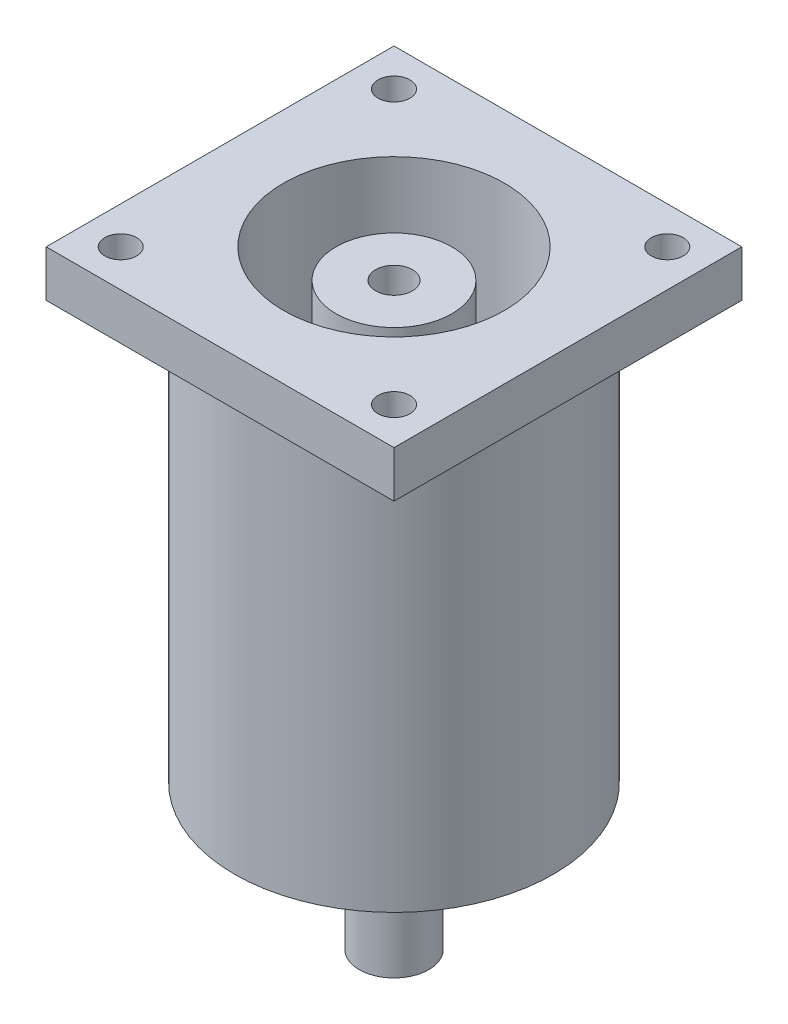
ISO-10303-21;
HEADER;
FILE_DESCRIPTION(('STEP AP214'),'2;1');
FILE_NAME('part.step','',(''),(''),'','','');
FILE_SCHEMA(('AUTOMOTIVE_DESIGN { 1 0 10303 214 1 1 1 1 }'));
ENDSEC;
DATA;
#1=APPLICATION_CONTEXT('core data for automotive mechanical design processes');
#2=APPLICATION_PROTOCOL_DEFINITION('international standard','automotive_design',2000,#1);
#3=PRODUCT_CONTEXT('',#1,'mechanical');
#4=PRODUCT('Part','Part','',(#3));
#5=PRODUCT_RELATED_PRODUCT_CATEGORY('part','',(#4));
#6=PRODUCT_DEFINITION_FORMATION('','',#4);
#7=PRODUCT_DEFINITION_CONTEXT('part definition',#1,'design');
#8=PRODUCT_DEFINITION('design','',#6,#7);
#9=PRODUCT_DEFINITION_SHAPE('','',#8);
#10=(LENGTH_UNIT() NAMED_UNIT(*) SI_UNIT(.MILLI.,.METRE.));
#11=(NAMED_UNIT(*) PLANE_ANGLE_UNIT() SI_UNIT($,.RADIAN.));
#12=(NAMED_UNIT(*) SI_UNIT($,.STERADIAN.) SOLID_ANGLE_UNIT());
#13=UNCERTAINTY_MEASURE_WITH_UNIT(LENGTH_MEASURE(1.E-05),#10,'distance_accuracy_value','');
#14=(GEOMETRIC_REPRESENTATION_CONTEXT(3) GLOBAL_UNCERTAINTY_ASSIGNED_CONTEXT((#13)) GLOBAL_UNIT_ASSIGNED_CONTEXT((#10,
#11,#12)) REPRESENTATION_CONTEXT('',''));
#15=CARTESIAN_POINT('',(0.,0.,0.));
#16=DIRECTION('',(0.,0.,1.));
#17=DIRECTION('',(1.,0.,0.));
#18=AXIS2_PLACEMENT_3D('',#15,#16,#17);
#19=CARTESIAN_POINT('',(0.,72.,0.));
#20=DIRECTION('',(0.,-1.,0.));
#21=DIRECTION('',(0.,0.,-1.));
#22=AXIS2_PLACEMENT_3D('',#19,#20,#21);
#23=CYLINDRICAL_SURFACE('',#22,27.5);
#24=CARTESIAN_POINT('',(0.,72.,0.));
#25=DIRECTION('',(0.,1.,0.));
#26=DIRECTION('',(0.,0.,1.));
#27=AXIS2_PLACEMENT_3D('',#24,#25,#26);
#28=CIRCLE('',#27,27.5);
#29=CARTESIAN_POINT('',(0.,72.,27.5));
#30=VERTEX_POINT('',#29);
#31=EDGE_CURVE('E139',#30,#30,#28,.T.);
#32=ORIENTED_EDGE('',*,*,#31,.F.);
#33=EDGE_LOOP('',(#32));
#34=FACE_BOUND('',#33,.T.);
#35=CARTESIAN_POINT('',(0.,0.,0.));
#36=DIRECTION('',(0.,1.,0.));
#37=DIRECTION('',(0.,0.,1.));
#38=AXIS2_PLACEMENT_3D('',#35,#36,#37);
#39=CIRCLE('',#38,27.5);
#40=CARTESIAN_POINT('',(0.,0.,27.5));
#41=VERTEX_POINT('',#40);
#42=EDGE_CURVE('E134',#41,#41,#39,.T.);
#43=ORIENTED_EDGE('',*,*,#42,.T.);
#44=EDGE_LOOP('',(#43));
#45=FACE_BOUND('',#44,.T.);
#46=ADVANCED_FACE('F39',(#34,#45),#23,.T.);
#47=CARTESIAN_POINT('',(0.,0.,0.));
#48=DIRECTION('',(0.,1.,0.));
#49=DIRECTION('',(0.,0.,1.));
#50=AXIS2_PLACEMENT_3D('',#47,#48,#49);
#51=PLANE('',#50);
#52=CARTESIAN_POINT('',(14.1421356237321,0.,-14.142135623731));
#53=DIRECTION('',(0.,-1.,0.));
#54=DIRECTION('',(0.,0.,-1.));
#55=AXIS2_PLACEMENT_3D('',#52,#53,#54);
#56=CIRCLE('',#55,1.99999999999969);
#57=CARTESIAN_POINT('',(14.1421356237321,0.,-16.1421356237306));
#58=VERTEX_POINT('',#57);
#59=EDGE_CURVE('E206',#58,#58,#56,.T.);
#60=ORIENTED_EDGE('',*,*,#59,.F.);
#61=EDGE_LOOP('',(#60));
#62=FACE_BOUND('',#61,.T.);
#63=CARTESIAN_POINT('',(-14.1421356237298,0.,-14.1421356237321));
#64=DIRECTION('',(0.,-1.,0.));
#65=DIRECTION('',(0.,0.,-1.));
#66=AXIS2_PLACEMENT_3D('',#63,#64,#65);
#67=CIRCLE('',#66,2.00000000000084);
#68=CARTESIAN_POINT('',(-14.1421356237298,0.,-16.142135623733));
#69=VERTEX_POINT('',#68);
#70=EDGE_CURVE('E198',#69,#69,#67,.T.);
#71=ORIENTED_EDGE('',*,*,#70,.F.);
#72=EDGE_LOOP('',(#71));
#73=FACE_BOUND('',#72,.T.);
#74=CARTESIAN_POINT('',(-14.1421356237309,0.,14.1421356237298));
#75=DIRECTION('',(0.,-1.,0.));
#76=DIRECTION('',(0.,0.,-1.));
#77=AXIS2_PLACEMENT_3D('',#74,#75,#76);
#78=CIRCLE('',#77,2.00000000000123);
#79=CARTESIAN_POINT('',(-14.1421356237309,0.,12.1421356237285));
#80=VERTEX_POINT('',#79);
#81=EDGE_CURVE('E189',#80,#80,#78,.T.);
#82=ORIENTED_EDGE('',*,*,#81,.F.);
#83=EDGE_LOOP('',(#82));
#84=FACE_BOUND('',#83,.T.);
#85=CARTESIAN_POINT('',(14.142135623731,0.,14.1421356237309));
#86=DIRECTION('',(0.,-1.,0.));
#87=DIRECTION('',(0.,0.,-1.));
#88=AXIS2_PLACEMENT_3D('',#85,#86,#87);
#89=CIRCLE('',#88,2.);
#90=CARTESIAN_POINT('',(14.142135623731,0.,12.1421356237309));
#91=VERTEX_POINT('',#90);
#92=EDGE_CURVE('E193',#91,#91,#89,.T.);
#93=ORIENTED_EDGE('',*,*,#92,.F.);
#94=EDGE_LOOP('',(#93));
#95=FACE_BOUND('',#94,.T.);
#96=CARTESIAN_POINT('',(0.,0.,0.));
#97=DIRECTION('',(0.,-1.,0.));
#98=DIRECTION('',(0.,0.,-1.));
#99=AXIS2_PLACEMENT_3D('',#96,#97,#98);
#100=CIRCLE('',#99,16.);
#101=CARTESIAN_POINT('',(0.,0.,-16.));
#102=VERTEX_POINT('',#101);
#103=EDGE_CURVE('E135',#102,#102,#100,.T.);
#104=ORIENTED_EDGE('',*,*,#103,.F.);
#105=EDGE_LOOP('',(#104));
#106=FACE_BOUND('',#105,.T.);
#107=ORIENTED_EDGE('',*,*,#42,.F.);
#108=EDGE_LOOP('',(#107));
#109=FACE_BOUND('',#108,.T.);
#110=ADVANCED_FACE('F240',(#62,#73,#84,#95,#106,#109),#51,.F.);
#111=CARTESIAN_POINT('',(0.,-2.5,0.));
#112=DIRECTION('',(0.,1.,0.));
#113=DIRECTION('',(0.,0.,1.));
#114=AXIS2_PLACEMENT_3D('',#111,#112,#113);
#115=CYLINDRICAL_SURFACE('',#114,16.);
#116=CARTESIAN_POINT('',(0.,-2.5,0.));
#117=DIRECTION('',(0.,-1.,0.));
#118=DIRECTION('',(0.,0.,-1.));
#119=AXIS2_PLACEMENT_3D('',#116,#117,#118);
#120=CIRCLE('',#119,16.);
#121=CARTESIAN_POINT('',(0.,-2.5,-16.));
#122=VERTEX_POINT('',#121);
#123=EDGE_CURVE('E130',#122,#122,#120,.T.);
#124=ORIENTED_EDGE('',*,*,#123,.F.);
#125=EDGE_LOOP('',(#124));
#126=FACE_BOUND('',#125,.T.);
#127=ORIENTED_EDGE('',*,*,#103,.T.);
#128=EDGE_LOOP('',(#127));
#129=FACE_BOUND('',#128,.T.);
#130=ADVANCED_FACE('F234',(#126,#129),#115,.T.);
#131=CARTESIAN_POINT('',(0.,-2.5,0.));
#132=DIRECTION('',(0.,-1.,0.));
#133=DIRECTION('',(0.,0.,-1.));
#134=AXIS2_PLACEMENT_3D('',#131,#132,#133);
#135=PLANE('',#134);
#136=CARTESIAN_POINT('',(0.,-2.5,0.));
#137=DIRECTION('',(0.,-1.,0.));
#138=DIRECTION('',(0.,0.,-1.));
#139=AXIS2_PLACEMENT_3D('',#136,#137,#138);
#140=CIRCLE('',#139,6.);
#141=CARTESIAN_POINT('',(0.,-2.5,6.));
#142=VERTEX_POINT('',#141);
#143=EDGE_CURVE('E49',#142,#142,#140,.T.);
#144=ORIENTED_EDGE('',*,*,#143,.F.);
#145=EDGE_LOOP('',(#144));
#146=FACE_BOUND('',#145,.T.);
#147=ORIENTED_EDGE('',*,*,#123,.T.);
#148=EDGE_LOOP('',(#147));
#149=FACE_BOUND('',#148,.T.);
#150=ADVANCED_FACE('F230',(#146,#149),#135,.T.);
#151=CARTESIAN_POINT('',(30.,80.,-30.));
#152=DIRECTION('',(-1.,0.,0.));
#153=DIRECTION('',(0.,0.,1.));
#154=AXIS2_PLACEMENT_3D('',#151,#152,#153);
#155=PLANE('',#154);
#156=DIRECTION('',(0.,0.,-1.));
#157=VECTOR('',#156,1.);
#158=CARTESIAN_POINT('',(30.,72.,-30.));
#159=LINE('',#158,#157);
#160=CARTESIAN_POINT('',(30.,72.,30.));
#161=VERTEX_POINT('',#160);
#162=CARTESIAN_POINT('',(30.,72.,-30.));
#163=VERTEX_POINT('',#162);
#164=EDGE_CURVE('E113',#161,#163,#159,.T.);
#165=ORIENTED_EDGE('',*,*,#164,.T.);
#166=DIRECTION('',(0.,-1.,0.));
#167=VECTOR('',#166,1.);
#168=CARTESIAN_POINT('',(30.,80.,-30.));
#169=LINE('',#168,#167);
#170=CARTESIAN_POINT('',(30.,80.,-30.));
#171=VERTEX_POINT('',#170);
#172=EDGE_CURVE('E102',#171,#163,#169,.T.);
#173=ORIENTED_EDGE('',*,*,#172,.F.);
#174=DIRECTION('',(0.,0.,-1.));
#175=VECTOR('',#174,1.);
#176=CARTESIAN_POINT('',(30.,80.,-30.));
#177=LINE('',#176,#175);
#178=CARTESIAN_POINT('',(30.,80.,30.));
#179=VERTEX_POINT('',#178);
#180=EDGE_CURVE('E94',#179,#171,#177,.T.);
#181=ORIENTED_EDGE('',*,*,#180,.F.);
#182=DIRECTION('',(0.,-1.,0.));
#183=VECTOR('',#182,1.);
#184=CARTESIAN_POINT('',(30.,80.,30.));
#185=LINE('',#184,#183);
#186=EDGE_CURVE('E109',#179,#161,#185,.T.);
#187=ORIENTED_EDGE('',*,*,#186,.T.);
#188=EDGE_LOOP('',(#165,#173,#181,#187));
#189=FACE_BOUND('',#188,.T.);
#190=ADVANCED_FACE('F233',(#189),#155,.F.);
#191=CARTESIAN_POINT('',(-30.,80.,-30.));
#192=DIRECTION('',(0.,0.,1.));
#193=DIRECTION('',(1.,0.,0.));
#194=AXIS2_PLACEMENT_3D('',#191,#192,#193);
#195=PLANE('',#194);
#196=DIRECTION('',(-1.,0.,0.));
#197=VECTOR('',#196,1.);
#198=CARTESIAN_POINT('',(-30.,72.,-30.));
#199=LINE('',#198,#197);
#200=CARTESIAN_POINT('',(-30.,72.,-30.));
#201=VERTEX_POINT('',#200);
#202=EDGE_CURVE('E100',#163,#201,#199,.T.);
#203=ORIENTED_EDGE('',*,*,#202,.T.);
#204=DIRECTION('',(0.,-1.,0.));
#205=VECTOR('',#204,1.);
#206=CARTESIAN_POINT('',(-30.,80.,-30.));
#207=LINE('',#206,#205);
#208=CARTESIAN_POINT('',(-30.,80.,-30.));
#209=VERTEX_POINT('',#208);
#210=EDGE_CURVE('E98',#209,#201,#207,.T.);
#211=ORIENTED_EDGE('',*,*,#210,.F.);
#212=DIRECTION('',(-1.,0.,0.));
#213=VECTOR('',#212,1.);
#214=CARTESIAN_POINT('',(-30.,80.,-30.));
#215=LINE('',#214,#213);
#216=EDGE_CURVE('E89',#171,#209,#215,.T.);
#217=ORIENTED_EDGE('',*,*,#216,.F.);
#218=ORIENTED_EDGE('',*,*,#172,.T.);
#219=EDGE_LOOP('',(#203,#211,#217,#218));
#220=FACE_BOUND('',#219,.T.);
#221=ADVANCED_FACE('F99',(#220),#195,.F.);
#222=CARTESIAN_POINT('',(-30.,80.,-30.));
#223=DIRECTION('',(1.,0.,0.));
#224=DIRECTION('',(0.,0.,-1.));
#225=AXIS2_PLACEMENT_3D('',#222,#223,#224);
#226=PLANE('',#225);
#227=DIRECTION('',(0.,0.,1.));
#228=VECTOR('',#227,1.);
#229=CARTESIAN_POINT('',(-30.,72.,-30.));
#230=LINE('',#229,#228);
#231=CARTESIAN_POINT('',(-30.,72.,30.));
#232=VERTEX_POINT('',#231);
#233=EDGE_CURVE('E75',#201,#232,#230,.T.);
#234=ORIENTED_EDGE('',*,*,#233,.T.);
#235=DIRECTION('',(0.,-1.,0.));
#236=VECTOR('',#235,1.);
#237=CARTESIAN_POINT('',(-30.,80.,30.));
#238=LINE('',#237,#236);
#239=CARTESIAN_POINT('',(-30.,80.,30.));
#240=VERTEX_POINT('',#239);
#241=EDGE_CURVE('E103',#240,#232,#238,.T.);
#242=ORIENTED_EDGE('',*,*,#241,.F.);
#243=DIRECTION('',(0.,0.,1.));
#244=VECTOR('',#243,1.);
#245=CARTESIAN_POINT('',(-30.,80.,-30.));
#246=LINE('',#245,#244);
#247=EDGE_CURVE('E92',#209,#240,#246,.T.);
#248=ORIENTED_EDGE('',*,*,#247,.F.);
#249=ORIENTED_EDGE('',*,*,#210,.T.);
#250=EDGE_LOOP('',(#234,#242,#248,#249));
#251=FACE_BOUND('',#250,.T.);
#252=ADVANCED_FACE('F105',(#251),#226,.F.);
#253=CARTESIAN_POINT('',(-30.,80.,30.));
#254=DIRECTION('',(0.,0.,-1.));
#255=DIRECTION('',(-1.,0.,0.));
#256=AXIS2_PLACEMENT_3D('',#253,#254,#255);
#257=PLANE('',#256);
#258=DIRECTION('',(1.,0.,0.));
#259=VECTOR('',#258,1.);
#260=CARTESIAN_POINT('',(-30.,72.,30.));
#261=LINE('',#260,#259);
#262=EDGE_CURVE('E81',#232,#161,#261,.T.);
#263=ORIENTED_EDGE('',*,*,#262,.T.);
#264=ORIENTED_EDGE('',*,*,#186,.F.);
#265=DIRECTION('',(1.,0.,0.));
#266=VECTOR('',#265,1.);
#267=CARTESIAN_POINT('',(-30.,80.,30.));
#268=LINE('',#267,#266);
#269=EDGE_CURVE('E58',#240,#179,#268,.T.);
#270=ORIENTED_EDGE('',*,*,#269,.F.);
#271=ORIENTED_EDGE('',*,*,#241,.T.);
#272=EDGE_LOOP('',(#263,#264,#270,#271));
#273=FACE_BOUND('',#272,.T.);
#274=ADVANCED_FACE('F261',(#273),#257,.F.);
#275=CARTESIAN_POINT('',(0.,80.,0.));
#276=DIRECTION('',(0.,1.,0.));
#277=DIRECTION('',(0.,0.,1.));
#278=AXIS2_PLACEMENT_3D('',#275,#276,#277);
#279=PLANE('',#278);
#280=CARTESIAN_POINT('',(23.5714045508536,80.,-23.5714045508535));
#281=DIRECTION('',(0.,1.,0.));
#282=DIRECTION('',(0.,0.,1.));
#283=AXIS2_PLACEMENT_3D('',#280,#281,#282);
#284=CIRCLE('',#283,2.75);
#285=CARTESIAN_POINT('',(23.5714045508536,80.,-20.8214045508535));
#286=VERTEX_POINT('',#285);
#287=EDGE_CURVE('E520',#286,#286,#284,.T.);
#288=ORIENTED_EDGE('',*,*,#287,.F.);
#289=EDGE_LOOP('',(#288));
#290=FACE_BOUND('',#289,.T.);
#291=CARTESIAN_POINT('',(-23.5714045508536,80.,-23.5714045508536));
#292=DIRECTION('',(0.,1.,0.));
#293=DIRECTION('',(0.,0.,1.));
#294=AXIS2_PLACEMENT_3D('',#291,#292,#293);
#295=CIRCLE('',#294,2.75);
#296=CARTESIAN_POINT('',(-23.5714045508536,80.,-20.8214045508536));
#297=VERTEX_POINT('',#296);
#298=EDGE_CURVE('E522',#297,#297,#295,.T.);
#299=ORIENTED_EDGE('',*,*,#298,.F.);
#300=EDGE_LOOP('',(#299));
#301=FACE_BOUND('',#300,.T.);
#302=CARTESIAN_POINT('',(-23.5714045508536,80.,23.5714045508535));
#303=DIRECTION('',(0.,1.,0.));
#304=DIRECTION('',(0.,0.,1.));
#305=AXIS2_PLACEMENT_3D('',#302,#303,#304);
#306=CIRCLE('',#305,2.75);
#307=CARTESIAN_POINT('',(-23.5714045508536,80.,26.3214045508535));
#308=VERTEX_POINT('',#307);
#309=EDGE_CURVE('E525',#308,#308,#306,.T.);
#310=ORIENTED_EDGE('',*,*,#309,.F.);
#311=EDGE_LOOP('',(#310));
#312=FACE_BOUND('',#311,.T.);
#313=CARTESIAN_POINT('',(23.5714045508536,80.,23.5714045508536));
#314=DIRECTION('',(0.,1.,0.));
#315=DIRECTION('',(0.,0.,1.));
#316=AXIS2_PLACEMENT_3D('',#313,#314,#315);
#317=CIRCLE('',#316,2.74999999999999);
#318=CARTESIAN_POINT('',(23.5714045508536,80.,26.3214045508536));
#319=VERTEX_POINT('',#318);
#320=EDGE_CURVE('E151',#319,#319,#317,.T.);
#321=ORIENTED_EDGE('',*,*,#320,.F.);
#322=EDGE_LOOP('',(#321));
#323=FACE_BOUND('',#322,.T.);
#324=CARTESIAN_POINT('',(0.,80.,0.));
#325=DIRECTION('',(0.,1.,0.));
#326=DIRECTION('',(0.,0.,1.));
#327=AXIS2_PLACEMENT_3D('',#324,#325,#326);
#328=CIRCLE('',#327,19.05);
#329=CARTESIAN_POINT('',(0.,80.,19.05));
#330=VERTEX_POINT('',#329);
#331=EDGE_CURVE('E179',#330,#330,#328,.T.);
#332=ORIENTED_EDGE('',*,*,#331,.F.);
#333=EDGE_LOOP('',(#332));
#334=FACE_BOUND('',#333,.T.);
#335=ORIENTED_EDGE('',*,*,#180,.T.);
#336=ORIENTED_EDGE('',*,*,#216,.T.);
#337=ORIENTED_EDGE('',*,*,#247,.T.);
#338=ORIENTED_EDGE('',*,*,#269,.T.);
#339=EDGE_LOOP('',(#335,#336,#337,#338));
#340=FACE_BOUND('',#339,.T.);
#341=ADVANCED_FACE('F90',(#290,#301,#312,#323,#334,#340),#279,.T.);
#342=CARTESIAN_POINT('',(0.,72.,0.));
#343=DIRECTION('',(0.,1.,0.));
#344=DIRECTION('',(0.,0.,1.));
#345=AXIS2_PLACEMENT_3D('',#342,#343,#344);
#346=PLANE('',#345);
#347=CARTESIAN_POINT('',(23.5714045508536,72.,-23.5714045508535));
#348=DIRECTION('',(0.,1.,0.));
#349=DIRECTION('',(0.,0.,1.));
#350=AXIS2_PLACEMENT_3D('',#347,#348,#349);
#351=CIRCLE('',#350,2.75);
#352=CARTESIAN_POINT('',(23.5714045508536,72.,-20.8214045508535));
#353=VERTEX_POINT('',#352);
#354=EDGE_CURVE('E42',#353,#353,#351,.T.);
#355=ORIENTED_EDGE('',*,*,#354,.T.);
#356=EDGE_LOOP('',(#355));
#357=FACE_BOUND('',#356,.T.);
#358=CARTESIAN_POINT('',(-23.5714045508536,72.,-23.5714045508536));
#359=DIRECTION('',(0.,1.,0.));
#360=DIRECTION('',(0.,0.,1.));
#361=AXIS2_PLACEMENT_3D('',#358,#359,#360);
#362=CIRCLE('',#361,2.75);
#363=CARTESIAN_POINT('',(-23.5714045508536,72.,-20.8214045508536));
#364=VERTEX_POINT('',#363);
#365=EDGE_CURVE('E154',#364,#364,#362,.T.);
#366=ORIENTED_EDGE('',*,*,#365,.T.);
#367=EDGE_LOOP('',(#366));
#368=FACE_BOUND('',#367,.T.);
#369=CARTESIAN_POINT('',(-23.5714045508536,72.,23.5714045508535));
#370=DIRECTION('',(0.,1.,0.));
#371=DIRECTION('',(0.,0.,1.));
#372=AXIS2_PLACEMENT_3D('',#369,#370,#371);
#373=CIRCLE('',#372,2.75);
#374=CARTESIAN_POINT('',(-23.5714045508536,72.,26.3214045508535));
#375=VERTEX_POINT('',#374);
#376=EDGE_CURVE('E150',#375,#375,#373,.T.);
#377=ORIENTED_EDGE('',*,*,#376,.T.);
#378=EDGE_LOOP('',(#377));
#379=FACE_BOUND('',#378,.T.);
#380=CARTESIAN_POINT('',(23.5714045508536,72.,23.5714045508536));
#381=DIRECTION('',(0.,1.,0.));
#382=DIRECTION('',(0.,0.,1.));
#383=AXIS2_PLACEMENT_3D('',#380,#381,#382);
#384=CIRCLE('',#383,2.74999999999999);
#385=CARTESIAN_POINT('',(23.5714045508536,72.,26.3214045508536));
#386=VERTEX_POINT('',#385);
#387=EDGE_CURVE('E146',#386,#386,#384,.T.);
#388=ORIENTED_EDGE('',*,*,#387,.T.);
#389=EDGE_LOOP('',(#388));
#390=FACE_BOUND('',#389,.T.);
#391=ORIENTED_EDGE('',*,*,#31,.T.);
#392=EDGE_LOOP('',(#391));
#393=FACE_BOUND('',#392,.T.);
#394=ORIENTED_EDGE('',*,*,#164,.F.);
#395=ORIENTED_EDGE('',*,*,#262,.F.);
#396=ORIENTED_EDGE('',*,*,#233,.F.);
#397=ORIENTED_EDGE('',*,*,#202,.F.);
#398=EDGE_LOOP('',(#394,#395,#396,#397));
#399=FACE_BOUND('',#398,.T.);
#400=ADVANCED_FACE('F255',(#357,#368,#379,#390,#393,#399),#346,.F.);
#401=CARTESIAN_POINT('',(0.,-25.,0.));
#402=DIRECTION('',(0.,1.,0.));
#403=DIRECTION('',(0.,0.,1.));
#404=AXIS2_PLACEMENT_3D('',#401,#402,#403);
#405=CYLINDRICAL_SURFACE('',#404,6.);
#406=CARTESIAN_POINT('',(0.,-25.,0.));
#407=DIRECTION('',(0.,-1.,0.));
#408=DIRECTION('',(0.,0.,-1.));
#409=AXIS2_PLACEMENT_3D('',#406,#407,#408);
#410=CIRCLE('',#409,6.);
#411=CARTESIAN_POINT('',(0.,-25.,6.));
#412=VERTEX_POINT('',#411);
#413=EDGE_CURVE('E117',#412,#412,#410,.T.);
#414=CARTESIAN_POINT('',(0.,-25.,6.));
#415=CARTESIAN_POINT('',(0.,-24.765625,6.));
#416=CARTESIAN_POINT('',(0.,-24.53125,6.));
#417=CARTESIAN_POINT('',(0.,-24.0625,6.));
#418=CARTESIAN_POINT('',(0.,-23.828125,6.));
#419=CARTESIAN_POINT('',(0.,-23.359375,6.));
#420=CARTESIAN_POINT('',(0.,-23.125,6.));
#421=CARTESIAN_POINT('',(0.,-22.65625,6.));
#422=CARTESIAN_POINT('',(0.,-22.421875,6.));
#423=CARTESIAN_POINT('',(0.,-21.953125,6.));
#424=CARTESIAN_POINT('',(0.,-21.71875,6.));
#425=CARTESIAN_POINT('',(0.,-21.25,6.));
#426=CARTESIAN_POINT('',(0.,-21.015625,6.));
#427=CARTESIAN_POINT('',(0.,-20.546875,6.));
#428=CARTESIAN_POINT('',(0.,-20.3125,6.));
#429=CARTESIAN_POINT('',(0.,-19.84375,6.));
#430=CARTESIAN_POINT('',(0.,-19.609375,6.));
#431=CARTESIAN_POINT('',(0.,-19.140625,6.));
#432=CARTESIAN_POINT('',(0.,-18.90625,6.));
#433=CARTESIAN_POINT('',(0.,-18.4375,6.));
#434=CARTESIAN_POINT('',(0.,-18.203125,6.));
#435=CARTESIAN_POINT('',(0.,-17.734375,6.));
#436=CARTESIAN_POINT('',(0.,-17.5,6.));
#437=CARTESIAN_POINT('',(0.,-17.03125,6.));
#438=CARTESIAN_POINT('',(0.,-16.796875,6.));
#439=CARTESIAN_POINT('',(0.,-16.328125,6.));
#440=CARTESIAN_POINT('',(0.,-16.09375,6.));
#441=CARTESIAN_POINT('',(0.,-15.625,6.));
#442=CARTESIAN_POINT('',(0.,-15.390625,6.));
#443=CARTESIAN_POINT('',(0.,-14.921875,6.));
#444=CARTESIAN_POINT('',(0.,-14.6875,6.));
#445=CARTESIAN_POINT('',(0.,-14.21875,6.));
#446=CARTESIAN_POINT('',(0.,-13.984375,6.));
#447=CARTESIAN_POINT('',(0.,-13.515625,6.));
#448=CARTESIAN_POINT('',(0.,-13.28125,6.));
#449=CARTESIAN_POINT('',(0.,-12.8125,6.));
#450=CARTESIAN_POINT('',(0.,-12.578125,6.));
#451=CARTESIAN_POINT('',(0.,-12.109375,6.));
#452=CARTESIAN_POINT('',(0.,-11.875,6.));
#453=CARTESIAN_POINT('',(0.,-11.40625,6.));
#454=CARTESIAN_POINT('',(0.,-11.171875,6.));
#455=CARTESIAN_POINT('',(0.,-10.703125,6.));
#456=CARTESIAN_POINT('',(0.,-10.46875,6.));
#457=CARTESIAN_POINT('',(0.,-10.,6.));
#458=CARTESIAN_POINT('',(0.,-9.765625,6.));
#459=CARTESIAN_POINT('',(0.,-9.296875,6.));
#460=CARTESIAN_POINT('',(0.,-9.0625,6.));
#461=CARTESIAN_POINT('',(0.,-8.59375,6.));
#462=CARTESIAN_POINT('',(0.,-8.359375,6.));
#463=CARTESIAN_POINT('',(0.,-7.890625,6.));
#464=CARTESIAN_POINT('',(0.,-7.65625,6.));
#465=CARTESIAN_POINT('',(0.,-7.1875,6.));
#466=CARTESIAN_POINT('',(0.,-6.953125,6.));
#467=CARTESIAN_POINT('',(0.,-6.484375,6.));
#468=CARTESIAN_POINT('',(0.,-6.25,6.));
#469=CARTESIAN_POINT('',(0.,-5.78125,6.));
#470=CARTESIAN_POINT('',(0.,-5.546875,6.));
#471=CARTESIAN_POINT('',(0.,-5.078125,6.));
#472=CARTESIAN_POINT('',(0.,-4.84375,6.));
#473=CARTESIAN_POINT('',(0.,-4.375,6.));
#474=CARTESIAN_POINT('',(0.,-4.140625,6.));
#475=CARTESIAN_POINT('',(0.,-3.671875,6.));
#476=CARTESIAN_POINT('',(0.,-3.4375,6.));
#477=CARTESIAN_POINT('',(0.,-2.96875,6.));
#478=CARTESIAN_POINT('',(0.,-2.734375,6.));
#479=CARTESIAN_POINT('',(0.,-2.5,6.));
#480=B_SPLINE_CURVE_WITH_KNOTS('',3,(#414,#415,#416,#417,#418,#419,#420,#421,#422,#423,#424,
#425,#426,#427,#428,#429,#430,#431,#432,#433,#434,#435,#436,#437,#438,#439,#440,#441,#442,#443,
#444,#445,#446,#447,#448,#449,#450,#451,#452,#453,#454,#455,#456,#457,#458,#459,#460,#461,#462,
#463,#464,#465,#466,#467,#468,#469,#470,#471,#472,#473,#474,#475,#476,#477,#478,#479),
.UNSPECIFIED.,.F.,.F.,(4,2,2,2,2,2,2,2,2,2,2,2,2,2,2,2,2,2,2,2,2,2,2,2,2,2,2,2,2,2,2,2,4),(0.,
0.703124999999999,1.40625,2.109375,2.8125,3.515625,4.21875,4.921875,5.625,6.328125,7.03125,
7.73437499999999,8.43749999999999,9.14062499999999,9.84374999999999,10.546875,11.25,11.953125,
12.65625,13.359375,14.0625,14.765625,15.46875,16.171875,16.875,17.578125,18.28125,18.984375,
19.6875,20.390625,21.09375,21.796875,22.5),.UNSPECIFIED.);
#481=EDGE_CURVE('BSEAM228',#412,#142,#480,.T.);
#482=ORIENTED_EDGE('',*,*,#413,.F.);
#483=ORIENTED_EDGE('',*,*,#143,.T.);
#484=ORIENTED_EDGE('',*,*,#481,.T.);
#485=ORIENTED_EDGE('',*,*,#481,.F.);
#486=EDGE_LOOP('',(#482,#484,#483,#485));
#487=FACE_BOUND('',#486,.T.);
#488=ADVANCED_FACE('F228',(#487),#405,.T.);
#489=CARTESIAN_POINT('',(0.,-25.,0.));
#490=DIRECTION('',(0.,-1.,0.));
#491=DIRECTION('',(0.,0.,-1.));
#492=AXIS2_PLACEMENT_3D('',#489,#490,#491);
#493=PLANE('',#492);
#494=ORIENTED_EDGE('',*,*,#413,.T.);
#495=EDGE_LOOP('',(#494));
#496=FACE_BOUND('',#495,.T.);
#497=ADVANCED_FACE('F307',(#496),#493,.T.);
#498=CARTESIAN_POINT('',(14.142135623731,16.,14.1421356237309));
#499=DIRECTION('',(0.,-1.,0.));
#500=DIRECTION('',(0.,0.,-1.));
#501=AXIS2_PLACEMENT_3D('',#498,#499,#500);
#502=CYLINDRICAL_SURFACE('',#501,2.);
#503=CARTESIAN_POINT('',(14.142135623731,16.,14.1421356237309));
#504=DIRECTION('',(0.,-1.,0.));
#505=DIRECTION('',(0.,0.,-1.));
#506=AXIS2_PLACEMENT_3D('',#503,#504,#505);
#507=CIRCLE('',#506,2.);
#508=CARTESIAN_POINT('',(14.142135623731,16.,12.1421356237309));
#509=VERTEX_POINT('',#508);
#510=EDGE_CURVE('E213',#509,#509,#507,.T.);
#511=ORIENTED_EDGE('',*,*,#510,.F.);
#512=EDGE_LOOP('',(#511));
#513=FACE_BOUND('',#512,.T.);
#514=ORIENTED_EDGE('',*,*,#92,.T.);
#515=EDGE_LOOP('',(#514));
#516=FACE_BOUND('',#515,.T.);
#517=ADVANCED_FACE('F318',(#513,#516),#502,.F.);
#518=CARTESIAN_POINT('',(14.142135623731,16.,14.1421356237309));
#519=DIRECTION('',(0.,-1.,0.));
#520=DIRECTION('',(0.,0.,-1.));
#521=AXIS2_PLACEMENT_3D('',#518,#519,#520);
#522=PLANE('',#521);
#523=ORIENTED_EDGE('',*,*,#510,.T.);
#524=EDGE_LOOP('',(#523));
#525=FACE_BOUND('',#524,.T.);
#526=ADVANCED_FACE('F335',(#525),#522,.T.);
#527=CARTESIAN_POINT('',(-14.1421356237309,16.,14.1421356237298));
#528=DIRECTION('',(0.,-1.,0.));
#529=DIRECTION('',(0.,0.,-1.));
#530=AXIS2_PLACEMENT_3D('',#527,#528,#529);
#531=CYLINDRICAL_SURFACE('',#530,2.00000000000123);
#532=CARTESIAN_POINT('',(-14.1421356237309,16.,14.1421356237298));
#533=DIRECTION('',(0.,-1.,0.));
#534=DIRECTION('',(0.,0.,-1.));
#535=AXIS2_PLACEMENT_3D('',#532,#533,#534);
#536=CIRCLE('',#535,2.00000000000123);
#537=CARTESIAN_POINT('',(-14.1421356237309,16.,12.1421356237285));
#538=VERTEX_POINT('',#537);
#539=EDGE_CURVE('E194',#538,#538,#536,.T.);
#540=ORIENTED_EDGE('',*,*,#539,.F.);
#541=EDGE_LOOP('',(#540));
#542=FACE_BOUND('',#541,.T.);
#543=ORIENTED_EDGE('',*,*,#81,.T.);
#544=EDGE_LOOP('',(#543));
#545=FACE_BOUND('',#544,.T.);
#546=ADVANCED_FACE('F345',(#542,#545),#531,.F.);
#547=CARTESIAN_POINT('',(-14.1421356237309,16.,14.1421356237298));
#548=DIRECTION('',(0.,-1.,0.));
#549=DIRECTION('',(0.,0.,-1.));
#550=AXIS2_PLACEMENT_3D('',#547,#548,#549);
#551=PLANE('',#550);
#552=ORIENTED_EDGE('',*,*,#539,.T.);
#553=EDGE_LOOP('',(#552));
#554=FACE_BOUND('',#553,.T.);
#555=ADVANCED_FACE('F355',(#554),#551,.T.);
#556=CARTESIAN_POINT('',(-14.1421356237298,16.,-14.1421356237321));
#557=DIRECTION('',(0.,-1.,0.));
#558=DIRECTION('',(0.,0.,-1.));
#559=AXIS2_PLACEMENT_3D('',#556,#557,#558);
#560=CYLINDRICAL_SURFACE('',#559,2.00000000000084);
#561=CARTESIAN_POINT('',(-14.1421356237298,16.,-14.1421356237321));
#562=DIRECTION('',(0.,-1.,0.));
#563=DIRECTION('',(0.,0.,-1.));
#564=AXIS2_PLACEMENT_3D('',#561,#562,#563);
#565=CIRCLE('',#564,2.00000000000084);
#566=CARTESIAN_POINT('',(-14.1421356237298,16.,-16.142135623733));
#567=VERTEX_POINT('',#566);
#568=EDGE_CURVE('E202',#567,#567,#565,.T.);
#569=ORIENTED_EDGE('',*,*,#568,.F.);
#570=EDGE_LOOP('',(#569));
#571=FACE_BOUND('',#570,.T.);
#572=ORIENTED_EDGE('',*,*,#70,.T.);
#573=EDGE_LOOP('',(#572));
#574=FACE_BOUND('',#573,.T.);
#575=ADVANCED_FACE('F365',(#571,#574),#560,.F.);
#576=CARTESIAN_POINT('',(-14.1421356237298,16.,-14.1421356237321));
#577=DIRECTION('',(0.,-1.,0.));
#578=DIRECTION('',(0.,0.,-1.));
#579=AXIS2_PLACEMENT_3D('',#576,#577,#578);
#580=PLANE('',#579);
#581=ORIENTED_EDGE('',*,*,#568,.T.);
#582=EDGE_LOOP('',(#581));
#583=FACE_BOUND('',#582,.T.);
#584=ADVANCED_FACE('F375',(#583),#580,.T.);
#585=CARTESIAN_POINT('',(14.1421356237321,16.,-14.142135623731));
#586=DIRECTION('',(0.,-1.,0.));
#587=DIRECTION('',(0.,0.,-1.));
#588=AXIS2_PLACEMENT_3D('',#585,#586,#587);
#589=CYLINDRICAL_SURFACE('',#588,1.99999999999969);
#590=CARTESIAN_POINT('',(14.1421356237321,16.,-14.142135623731));
#591=DIRECTION('',(0.,-1.,0.));
#592=DIRECTION('',(0.,0.,-1.));
#593=AXIS2_PLACEMENT_3D('',#590,#591,#592);
#594=CIRCLE('',#593,1.99999999999969);
#595=CARTESIAN_POINT('',(14.1421356237321,16.,-16.1421356237306));
#596=VERTEX_POINT('',#595);
#597=EDGE_CURVE('E185',#596,#596,#594,.T.);
#598=ORIENTED_EDGE('',*,*,#597,.F.);
#599=EDGE_LOOP('',(#598));
#600=FACE_BOUND('',#599,.T.);
#601=ORIENTED_EDGE('',*,*,#59,.T.);
#602=EDGE_LOOP('',(#601));
#603=FACE_BOUND('',#602,.T.);
#604=ADVANCED_FACE('F385',(#600,#603),#589,.F.);
#605=CARTESIAN_POINT('',(14.1421356237321,16.,-14.142135623731));
#606=DIRECTION('',(0.,-1.,0.));
#607=DIRECTION('',(0.,0.,-1.));
#608=AXIS2_PLACEMENT_3D('',#605,#606,#607);
#609=PLANE('',#608);
#610=ORIENTED_EDGE('',*,*,#597,.T.);
#611=EDGE_LOOP('',(#610));
#612=FACE_BOUND('',#611,.T.);
#613=ADVANCED_FACE('F395',(#612),#609,.T.);
#614=CARTESIAN_POINT('',(0.,55.,0.));
#615=DIRECTION('',(0.,1.,0.));
#616=DIRECTION('',(0.,0.,1.));
#617=AXIS2_PLACEMENT_3D('',#614,#615,#616);
#618=CYLINDRICAL_SURFACE('',#617,19.05);
#619=CARTESIAN_POINT('',(0.,55.,0.));
#620=DIRECTION('',(0.,1.,0.));
#621=DIRECTION('',(0.,0.,1.));
#622=AXIS2_PLACEMENT_3D('',#619,#620,#621);
#623=CIRCLE('',#622,19.05);
#624=CARTESIAN_POINT('',(0.,55.,19.05));
#625=VERTEX_POINT('',#624);
#626=EDGE_CURVE('E181',#625,#625,#623,.T.);
#627=ORIENTED_EDGE('',*,*,#626,.F.);
#628=EDGE_LOOP('',(#627));
#629=FACE_BOUND('',#628,.T.);
#630=ORIENTED_EDGE('',*,*,#331,.T.);
#631=EDGE_LOOP('',(#630));
#632=FACE_BOUND('',#631,.T.);
#633=ADVANCED_FACE('F405',(#629,#632),#618,.F.);
#634=CARTESIAN_POINT('',(0.,55.,0.));
#635=DIRECTION('',(0.,1.,0.));
#636=DIRECTION('',(0.,0.,1.));
#637=AXIS2_PLACEMENT_3D('',#634,#635,#636);
#638=PLANE('',#637);
#639=CARTESIAN_POINT('',(0.,55.,0.));
#640=DIRECTION('',(0.,1.,0.));
#641=DIRECTION('',(0.,0.,1.));
#642=AXIS2_PLACEMENT_3D('',#639,#640,#641);
#643=CIRCLE('',#642,10.);
#644=CARTESIAN_POINT('',(0.,55.,10.));
#645=VERTEX_POINT('',#644);
#646=EDGE_CURVE('E166',#645,#645,#643,.T.);
#647=ORIENTED_EDGE('',*,*,#646,.F.);
#648=EDGE_LOOP('',(#647));
#649=FACE_BOUND('',#648,.T.);
#650=ORIENTED_EDGE('',*,*,#626,.T.);
#651=EDGE_LOOP('',(#650));
#652=FACE_BOUND('',#651,.T.);
#653=ADVANCED_FACE('F415',(#649,#652),#638,.T.);
#654=CARTESIAN_POINT('',(0.,75.,0.));
#655=DIRECTION('',(0.,1.,0.));
#656=DIRECTION('',(0.,0.,1.));
#657=AXIS2_PLACEMENT_3D('',#654,#655,#656);
#658=PLANE('',#657);
#659=CARTESIAN_POINT('',(0.,75.,0.));
#660=DIRECTION('',(0.,1.,0.));
#661=DIRECTION('',(0.,0.,1.));
#662=AXIS2_PLACEMENT_3D('',#659,#660,#661);
#663=CIRCLE('',#662,10.);
#664=CARTESIAN_POINT('',(0.,75.,10.));
#665=VERTEX_POINT('',#664);
#666=EDGE_CURVE('E172',#665,#665,#663,.T.);
#667=ORIENTED_EDGE('',*,*,#666,.T.);
#668=EDGE_LOOP('',(#667));
#669=FACE_BOUND('',#668,.T.);
#670=CARTESIAN_POINT('',(0.,75.,0.));
#671=DIRECTION('',(0.,1.,0.));
#672=DIRECTION('',(0.,0.,1.));
#673=AXIS2_PLACEMENT_3D('',#670,#671,#672);
#674=CIRCLE('',#673,3.175);
#675=CARTESIAN_POINT('',(0.,75.,3.175));
#676=VERTEX_POINT('',#675);
#677=EDGE_CURVE('E161',#676,#676,#674,.T.);
#678=ORIENTED_EDGE('',*,*,#677,.F.);
#679=EDGE_LOOP('',(#678));
#680=FACE_BOUND('',#679,.T.);
#681=ADVANCED_FACE('F425',(#669,#680),#658,.T.);
#682=CARTESIAN_POINT('',(0.,75.,0.));
#683=DIRECTION('',(0.,-1.,0.));
#684=DIRECTION('',(0.,0.,-1.));
#685=AXIS2_PLACEMENT_3D('',#682,#683,#684);
#686=CYLINDRICAL_SURFACE('',#685,10.);
#687=ORIENTED_EDGE('',*,*,#666,.F.);
#688=EDGE_LOOP('',(#687));
#689=FACE_BOUND('',#688,.T.);
#690=ORIENTED_EDGE('',*,*,#646,.T.);
#691=EDGE_LOOP('',(#690));
#692=FACE_BOUND('',#691,.T.);
#693=ADVANCED_FACE('F437',(#689,#692),#686,.T.);
#694=CARTESIAN_POINT('',(0.,75.,0.));
#695=DIRECTION('',(0.,-1.,0.));
#696=DIRECTION('',(0.,0.,-1.));
#697=AXIS2_PLACEMENT_3D('',#694,#695,#696);
#698=CYLINDRICAL_SURFACE('',#697,3.175);
#699=ORIENTED_EDGE('',*,*,#677,.T.);
#700=EDGE_LOOP('',(#699));
#701=FACE_BOUND('',#700,.T.);
#702=CARTESIAN_POINT('',(0.,55.,0.));
#703=DIRECTION('',(0.,1.,0.));
#704=DIRECTION('',(0.,0.,1.));
#705=AXIS2_PLACEMENT_3D('',#702,#703,#704);
#706=CIRCLE('',#705,3.175);
#707=CARTESIAN_POINT('',(0.,55.,3.175));
#708=VERTEX_POINT('',#707);
#709=EDGE_CURVE('E11',#708,#708,#706,.F.);
#710=ORIENTED_EDGE('',*,*,#709,.T.);
#711=EDGE_LOOP('',(#710));
#712=FACE_BOUND('',#711,.T.);
#713=ADVANCED_FACE('F447',(#701,#712),#698,.F.);
#714=ORIENTED_EDGE('',*,*,#709,.F.);
#715=EDGE_LOOP('',(#714));
#716=FACE_BOUND('',#715,.T.);
#717=ADVANCED_FACE('F428',(#716),#638,.T.);
#718=CARTESIAN_POINT('',(23.5714045508536,70.,23.5714045508536));
#719=DIRECTION('',(0.,1.,0.));
#720=DIRECTION('',(0.,0.,1.));
#721=AXIS2_PLACEMENT_3D('',#718,#719,#720);
#722=CYLINDRICAL_SURFACE('',#721,2.74999999999999);
#723=ORIENTED_EDGE('',*,*,#320,.T.);
#724=EDGE_LOOP('',(#723));
#725=FACE_BOUND('',#724,.T.);
#726=ORIENTED_EDGE('',*,*,#387,.F.);
#727=EDGE_LOOP('',(#726));
#728=FACE_BOUND('',#727,.T.);
#729=ADVANCED_FACE('F465',(#725,#728),#722,.F.);
#730=CARTESIAN_POINT('',(-23.5714045508536,70.,23.5714045508535));
#731=DIRECTION('',(0.,1.,0.));
#732=DIRECTION('',(0.,0.,1.));
#733=AXIS2_PLACEMENT_3D('',#730,#731,#732);
#734=CYLINDRICAL_SURFACE('',#733,2.75);
#735=ORIENTED_EDGE('',*,*,#309,.T.);
#736=EDGE_LOOP('',(#735));
#737=FACE_BOUND('',#736,.T.);
#738=ORIENTED_EDGE('',*,*,#376,.F.);
#739=EDGE_LOOP('',(#738));
#740=FACE_BOUND('',#739,.T.);
#741=ADVANCED_FACE('F483',(#737,#740),#734,.F.);
#742=CARTESIAN_POINT('',(-23.5714045508536,70.,-23.5714045508536));
#743=DIRECTION('',(0.,1.,0.));
#744=DIRECTION('',(0.,0.,1.));
#745=AXIS2_PLACEMENT_3D('',#742,#743,#744);
#746=CYLINDRICAL_SURFACE('',#745,2.75);
#747=ORIENTED_EDGE('',*,*,#298,.T.);
#748=EDGE_LOOP('',(#747));
#749=FACE_BOUND('',#748,.T.);
#750=ORIENTED_EDGE('',*,*,#365,.F.);
#751=EDGE_LOOP('',(#750));
#752=FACE_BOUND('',#751,.T.);
#753=ADVANCED_FACE('F493',(#749,#752),#746,.F.);
#754=CARTESIAN_POINT('',(23.5714045508536,70.,-23.5714045508535));
#755=DIRECTION('',(0.,1.,0.));
#756=DIRECTION('',(0.,0.,1.));
#757=AXIS2_PLACEMENT_3D('',#754,#755,#756);
#758=CYLINDRICAL_SURFACE('',#757,2.75);
#759=ORIENTED_EDGE('',*,*,#287,.T.);
#760=EDGE_LOOP('',(#759));
#761=FACE_BOUND('',#760,.T.);
#762=ORIENTED_EDGE('',*,*,#354,.F.);
#763=EDGE_LOOP('',(#762));
#764=FACE_BOUND('',#763,.T.);
#765=ADVANCED_FACE('F503',(#761,#764),#758,.F.);
#766=CLOSED_SHELL('',(#46,#110,#130,#150,#190,#221,#252,#274,#341,#400,#488,#497,#517,#526,#546,
#555,#575,#584,#604,#613,#633,#653,#681,#693,#713,#717,#729,#741,#753,#765));
#767=MANIFOLD_SOLID_BREP('B2',#766);
#768=ADVANCED_BREP_SHAPE_REPRESENTATION('',(#18,#767),#14);
#769=SHAPE_DEFINITION_REPRESENTATION(#9,#768);
ENDSEC;
END-ISO-10303-21;
